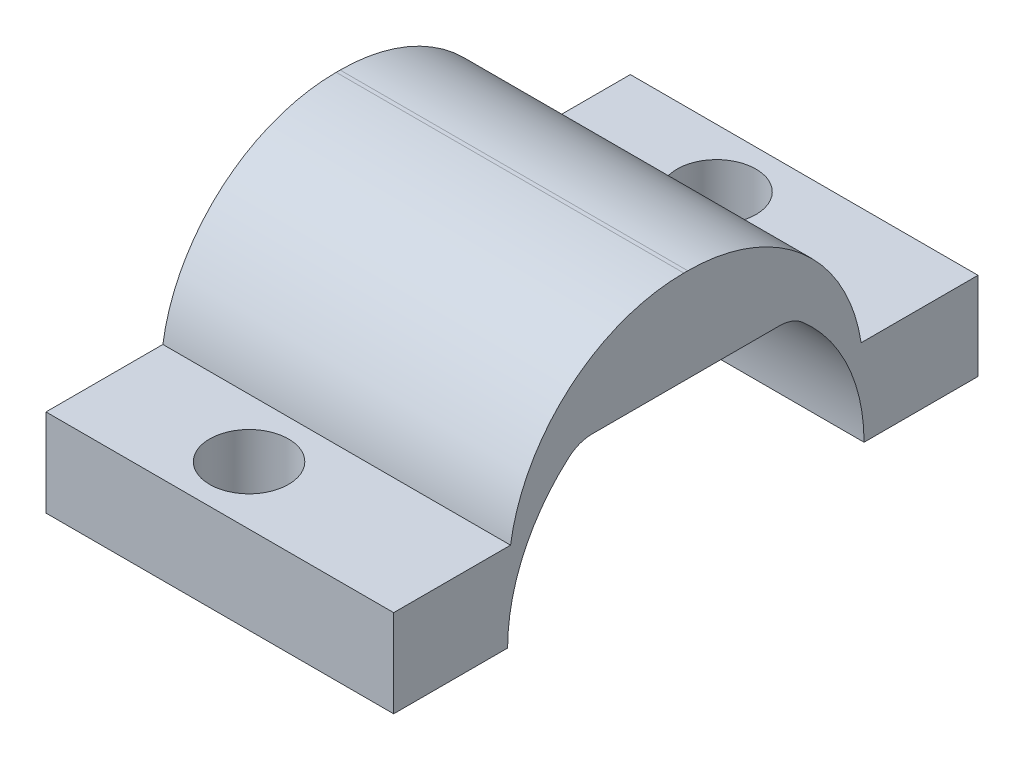
ISO-10303-21;
HEADER;
FILE_DESCRIPTION(('STEP AP214'),'2;1');
FILE_NAME('part.step','',(''),(''),'','','');
FILE_SCHEMA(('AUTOMOTIVE_DESIGN { 1 0 10303 214 1 1 1 1 }'));
ENDSEC;
DATA;
#1=APPLICATION_CONTEXT('core data for automotive mechanical design processes');
#2=APPLICATION_PROTOCOL_DEFINITION('international standard','automotive_design',2000,#1);
#3=PRODUCT_CONTEXT('',#1,'mechanical');
#4=PRODUCT('Part','Part','',(#3));
#5=PRODUCT_RELATED_PRODUCT_CATEGORY('part','',(#4));
#6=PRODUCT_DEFINITION_FORMATION('','',#4);
#7=PRODUCT_DEFINITION_CONTEXT('part definition',#1,'design');
#8=PRODUCT_DEFINITION('design','',#6,#7);
#9=PRODUCT_DEFINITION_SHAPE('','',#8);
#10=(LENGTH_UNIT() NAMED_UNIT(*) SI_UNIT(.MILLI.,.METRE.));
#11=(NAMED_UNIT(*) PLANE_ANGLE_UNIT() SI_UNIT($,.RADIAN.));
#12=(NAMED_UNIT(*) SI_UNIT($,.STERADIAN.) SOLID_ANGLE_UNIT());
#13=UNCERTAINTY_MEASURE_WITH_UNIT(LENGTH_MEASURE(1.E-05),#10,'distance_accuracy_value','');
#14=(GEOMETRIC_REPRESENTATION_CONTEXT(3) GLOBAL_UNCERTAINTY_ASSIGNED_CONTEXT((#13)) GLOBAL_UNIT_ASSIGNED_CONTEXT((#10,
#11,#12)) REPRESENTATION_CONTEXT('',''));
#15=CARTESIAN_POINT('',(0.,0.,0.));
#16=DIRECTION('',(0.,0.,1.));
#17=DIRECTION('',(1.,0.,0.));
#18=AXIS2_PLACEMENT_3D('',#15,#16,#17);
#19=CARTESIAN_POINT('',(13.9,0.,0.));
#20=DIRECTION('',(-1.,0.,0.));
#21=DIRECTION('',(0.,0.,1.));
#22=AXIS2_PLACEMENT_3D('',#19,#20,#21);
#23=CYLINDRICAL_SURFACE('',#22,6.1);
#24=CARTESIAN_POINT('',(2.,0.,0.));
#25=DIRECTION('',(1.,0.,0.));
#26=DIRECTION('',(0.,0.,-1.));
#27=AXIS2_PLACEMENT_3D('',#24,#25,#26);
#28=CIRCLE('',#27,6.1);
#29=CARTESIAN_POINT('',(2.,4.60612244897959,3.99920441900714));
#30=VERTEX_POINT('',#29);
#31=CARTESIAN_POINT('',(2.,0.,6.1));
#32=VERTEX_POINT('',#31);
#33=EDGE_CURVE('E236',#30,#32,#28,.T.);
#34=ORIENTED_EDGE('',*,*,#33,.F.);
#35=DIRECTION('',(-1.,0.,0.));
#36=VECTOR('',#35,1.);
#37=CARTESIAN_POINT('',(13.9,4.60612244897959,3.99920441900714));
#38=LINE('',#37,#36);
#39=CARTESIAN_POINT('',(13.9,4.60612244897959,3.99920441900714));
#40=VERTEX_POINT('',#39);
#41=EDGE_CURVE('E69',#30,#40,#38,.F.);
#42=ORIENTED_EDGE('',*,*,#41,.T.);
#43=CARTESIAN_POINT('',(13.9,0.,0.));
#44=DIRECTION('',(1.,0.,0.));
#45=DIRECTION('',(0.,0.,-1.));
#46=AXIS2_PLACEMENT_3D('',#43,#44,#45);
#47=CIRCLE('',#46,6.1);
#48=CARTESIAN_POINT('',(13.9,0.,6.1));
#49=VERTEX_POINT('',#48);
#50=EDGE_CURVE('E227',#40,#49,#47,.T.);
#51=ORIENTED_EDGE('',*,*,#50,.T.);
#52=DIRECTION('',(-1.,0.,0.));
#53=VECTOR('',#52,1.);
#54=CARTESIAN_POINT('',(13.9,0.,6.1));
#55=LINE('',#54,#53);
#56=EDGE_CURVE('E240',#49,#32,#55,.T.);
#57=ORIENTED_EDGE('',*,*,#56,.T.);
#58=EDGE_LOOP('',(#34,#42,#51,#57));
#59=FACE_BOUND('',#58,.T.);
#60=ADVANCED_FACE('F46',(#59),#23,.F.);
#61=CARTESIAN_POINT('',(13.9,4.9,0.));
#62=DIRECTION('',(0.,1.,0.));
#63=DIRECTION('',(0.,0.,1.));
#64=AXIS2_PLACEMENT_3D('',#61,#62,#63);
#65=PLANE('',#64);
#66=DIRECTION('',(-1.,0.,0.));
#67=VECTOR('',#66,1.);
#68=CARTESIAN_POINT('',(13.9,4.9,3.2124756808418));
#69=LINE('',#68,#67);
#70=CARTESIAN_POINT('',(13.9,4.9,3.2124756808418));
#71=VERTEX_POINT('',#70);
#72=CARTESIAN_POINT('',(2.,4.9,3.2124756808418));
#73=VERTEX_POINT('',#72);
#74=EDGE_CURVE('E206',#71,#73,#69,.T.);
#75=ORIENTED_EDGE('',*,*,#74,.T.);
#76=DIRECTION('',(0.,0.,-1.));
#77=VECTOR('',#76,1.);
#78=CARTESIAN_POINT('',(2.,4.9,0.));
#79=LINE('',#78,#77);
#80=CARTESIAN_POINT('',(2.,4.9,-3.2124756808418));
#81=VERTEX_POINT('',#80);
#82=EDGE_CURVE('E62',#73,#81,#79,.T.);
#83=ORIENTED_EDGE('',*,*,#82,.T.);
#84=DIRECTION('',(-1.,0.,0.));
#85=VECTOR('',#84,1.);
#86=CARTESIAN_POINT('',(13.9,4.9,-3.2124756808418));
#87=LINE('',#86,#85);
#88=CARTESIAN_POINT('',(13.9,4.9,-3.2124756808418));
#89=VERTEX_POINT('',#88);
#90=EDGE_CURVE('E210',#81,#89,#87,.F.);
#91=ORIENTED_EDGE('',*,*,#90,.T.);
#92=DIRECTION('',(0.,0.,-1.));
#93=VECTOR('',#92,1.);
#94=CARTESIAN_POINT('',(13.9,4.9,0.));
#95=LINE('',#94,#93);
#96=EDGE_CURVE('E224',#71,#89,#95,.T.);
#97=ORIENTED_EDGE('',*,*,#96,.F.);
#98=EDGE_LOOP('',(#75,#83,#91,#97));
#99=FACE_BOUND('',#98,.T.);
#100=ADVANCED_FACE('F231',(#99),#65,.F.);
#101=CARTESIAN_POINT('',(2.,0.,0.));
#102=DIRECTION('',(1.,0.,0.));
#103=DIRECTION('',(0.,0.,-1.));
#104=AXIS2_PLACEMENT_3D('',#101,#102,#103);
#105=CIRCLE('',#104,6.1);
#106=CARTESIAN_POINT('',(2.,0.,-6.1));
#107=VERTEX_POINT('',#106);
#108=CARTESIAN_POINT('',(2.,4.60612244897959,-3.99920441900714));
#109=VERTEX_POINT('',#108);
#110=EDGE_CURVE('E247',#107,#109,#105,.T.);
#111=ORIENTED_EDGE('',*,*,#110,.F.);
#112=DIRECTION('',(-1.,0.,0.));
#113=VECTOR('',#112,1.);
#114=CARTESIAN_POINT('',(13.9,0.,-6.1));
#115=LINE('',#114,#113);
#116=CARTESIAN_POINT('',(13.9,0.,-6.1));
#117=VERTEX_POINT('',#116);
#118=EDGE_CURVE('E167',#117,#107,#115,.T.);
#119=ORIENTED_EDGE('',*,*,#118,.F.);
#120=CARTESIAN_POINT('',(13.9,4.60612244897959,-3.99920441900714));
#121=VERTEX_POINT('',#120);
#122=EDGE_CURVE('E234',#117,#121,#47,.T.);
#123=ORIENTED_EDGE('',*,*,#122,.T.);
#124=DIRECTION('',(-1.,0.,0.));
#125=VECTOR('',#124,1.);
#126=CARTESIAN_POINT('',(13.9,4.60612244897959,-3.99920441900714));
#127=LINE('',#126,#125);
#128=EDGE_CURVE('E196',#121,#109,#127,.T.);
#129=ORIENTED_EDGE('',*,*,#128,.T.);
#130=EDGE_LOOP('',(#111,#119,#123,#129));
#131=FACE_BOUND('',#130,.T.);
#132=ADVANCED_FACE('F332',(#131),#23,.F.);
#133=CARTESIAN_POINT('',(13.9,0.,0.));
#134=DIRECTION('',(0.,1.,0.));
#135=DIRECTION('',(0.,0.,1.));
#136=AXIS2_PLACEMENT_3D('',#133,#134,#135);
#137=PLANE('',#136);
#138=CARTESIAN_POINT('',(6.95,0.,-8.));
#139=DIRECTION('',(0.,1.,0.));
#140=DIRECTION('',(0.,0.,1.));
#141=AXIS2_PLACEMENT_3D('',#138,#139,#140);
#142=CIRCLE('',#141,1.35);
#143=CARTESIAN_POINT('',(6.95,0.,-6.65));
#144=VERTEX_POINT('',#143);
#145=EDGE_CURVE('E201',#144,#144,#142,.T.);
#146=ORIENTED_EDGE('',*,*,#145,.T.);
#147=EDGE_LOOP('',(#146));
#148=FACE_BOUND('',#147,.T.);
#149=ORIENTED_EDGE('',*,*,#118,.T.);
#150=DIRECTION('',(0.,0.,-1.));
#151=VECTOR('',#150,1.);
#152=CARTESIAN_POINT('',(2.,0.,-10.));
#153=LINE('',#152,#151);
#154=CARTESIAN_POINT('',(2.,0.,-10.));
#155=VERTEX_POINT('',#154);
#156=EDGE_CURVE('E149',#107,#155,#153,.T.);
#157=ORIENTED_EDGE('',*,*,#156,.T.);
#158=DIRECTION('',(-1.,0.,0.));
#159=VECTOR('',#158,1.);
#160=CARTESIAN_POINT('',(13.9,0.,-10.));
#161=LINE('',#160,#159);
#162=CARTESIAN_POINT('',(13.9,0.,-10.));
#163=VERTEX_POINT('',#162);
#164=EDGE_CURVE('E165',#163,#155,#161,.T.);
#165=ORIENTED_EDGE('',*,*,#164,.F.);
#166=DIRECTION('',(0.,0.,-1.));
#167=VECTOR('',#166,1.);
#168=CARTESIAN_POINT('',(13.9,0.,0.));
#169=LINE('',#168,#167);
#170=EDGE_CURVE('E279',#117,#163,#169,.T.);
#171=ORIENTED_EDGE('',*,*,#170,.F.);
#172=EDGE_LOOP('',(#149,#157,#165,#171));
#173=FACE_BOUND('',#172,.T.);
#174=ADVANCED_FACE('F163',(#148,#173),#137,.F.);
#175=CARTESIAN_POINT('',(13.9,0.,-10.));
#176=DIRECTION('',(0.,0.,1.));
#177=DIRECTION('',(1.,0.,0.));
#178=AXIS2_PLACEMENT_3D('',#175,#176,#177);
#179=PLANE('',#178);
#180=ORIENTED_EDGE('',*,*,#164,.T.);
#181=DIRECTION('',(0.,1.,0.));
#182=VECTOR('',#181,1.);
#183=CARTESIAN_POINT('',(2.,0.,-10.));
#184=LINE('',#183,#182);
#185=CARTESIAN_POINT('',(2.,3.,-10.));
#186=VERTEX_POINT('',#185);
#187=EDGE_CURVE('E146',#155,#186,#184,.T.);
#188=ORIENTED_EDGE('',*,*,#187,.T.);
#189=DIRECTION('',(-1.,0.,0.));
#190=VECTOR('',#189,1.);
#191=CARTESIAN_POINT('',(13.9,3.,-10.));
#192=LINE('',#191,#190);
#193=CARTESIAN_POINT('',(13.9,3.,-10.));
#194=VERTEX_POINT('',#193);
#195=EDGE_CURVE('E174',#194,#186,#192,.T.);
#196=ORIENTED_EDGE('',*,*,#195,.F.);
#197=DIRECTION('',(0.,1.,0.));
#198=VECTOR('',#197,1.);
#199=CARTESIAN_POINT('',(13.9,0.,-10.));
#200=LINE('',#199,#198);
#201=EDGE_CURVE('E172',#163,#194,#200,.T.);
#202=ORIENTED_EDGE('',*,*,#201,.F.);
#203=EDGE_LOOP('',(#180,#188,#196,#202));
#204=FACE_BOUND('',#203,.T.);
#205=ADVANCED_FACE('F171',(#204),#179,.F.);
#206=CARTESIAN_POINT('',(13.9,3.,0.));
#207=DIRECTION('',(0.,-1.,0.));
#208=DIRECTION('',(0.,0.,-1.));
#209=AXIS2_PLACEMENT_3D('',#206,#207,#208);
#210=PLANE('',#209);
#211=CARTESIAN_POINT('',(6.95,3.,-8.));
#212=DIRECTION('',(0.,1.,0.));
#213=DIRECTION('',(0.,0.,1.));
#214=AXIS2_PLACEMENT_3D('',#211,#212,#213);
#215=CIRCLE('',#214,1.35);
#216=CARTESIAN_POINT('',(6.95,3.,-6.65));
#217=VERTEX_POINT('',#216);
#218=EDGE_CURVE('E202',#217,#217,#215,.T.);
#219=ORIENTED_EDGE('',*,*,#218,.F.);
#220=EDGE_LOOP('',(#219));
#221=FACE_BOUND('',#220,.T.);
#222=ORIENTED_EDGE('',*,*,#195,.T.);
#223=DIRECTION('',(0.,0.,1.));
#224=VECTOR('',#223,1.);
#225=CARTESIAN_POINT('',(2.,3.,0.));
#226=LINE('',#225,#224);
#227=CARTESIAN_POINT('',(2.,3.,-6.));
#228=VERTEX_POINT('',#227);
#229=EDGE_CURVE('E152',#186,#228,#226,.T.);
#230=ORIENTED_EDGE('',*,*,#229,.T.);
#231=DIRECTION('',(-1.,0.,0.));
#232=VECTOR('',#231,1.);
#233=CARTESIAN_POINT('',(13.9,3.,-6.));
#234=LINE('',#233,#232);
#235=CARTESIAN_POINT('',(13.9,3.,-6.));
#236=VERTEX_POINT('',#235);
#237=EDGE_CURVE('E180',#236,#228,#234,.T.);
#238=ORIENTED_EDGE('',*,*,#237,.F.);
#239=DIRECTION('',(0.,0.,1.));
#240=VECTOR('',#239,1.);
#241=CARTESIAN_POINT('',(13.9,3.,0.));
#242=LINE('',#241,#240);
#243=EDGE_CURVE('E284',#194,#236,#242,.T.);
#244=ORIENTED_EDGE('',*,*,#243,.F.);
#245=EDGE_LOOP('',(#222,#230,#238,#244));
#246=FACE_BOUND('',#245,.T.);
#247=ADVANCED_FACE('F326',(#221,#246),#210,.F.);
#248=CARTESIAN_POINT('',(13.9,8.1,0.));
#249=DIRECTION('',(0.,1.,0.));
#250=DIRECTION('',(0.,0.,1.));
#251=AXIS2_PLACEMENT_3D('',#248,#249,#250);
#252=PLANE('',#251);
#253=DIRECTION('',(0.,0.,-1.));
#254=VECTOR('',#253,1.);
#255=CARTESIAN_POINT('',(2.,8.1,-10.));
#256=LINE('',#255,#254);
#257=CARTESIAN_POINT('',(2.,8.1,0.0678840200144422));
#258=VERTEX_POINT('',#257);
#259=CARTESIAN_POINT('',(2.,8.1,-0.0678840200144405));
#260=VERTEX_POINT('',#259);
#261=EDGE_CURVE('E169',#258,#260,#256,.T.);
#262=ORIENTED_EDGE('',*,*,#261,.F.);
#263=DIRECTION('',(1.,0.,0.));
#264=VECTOR('',#263,1.);
#265=CARTESIAN_POINT('',(13.9,8.1,0.0678840200144413));
#266=LINE('',#265,#264);
#267=CARTESIAN_POINT('',(13.9,8.1,0.0678840200144413));
#268=VERTEX_POINT('',#267);
#269=EDGE_CURVE('E187',#258,#268,#266,.T.);
#270=ORIENTED_EDGE('',*,*,#269,.T.);
#271=DIRECTION('',(0.,0.,-1.));
#272=VECTOR('',#271,1.);
#273=CARTESIAN_POINT('',(13.9,8.1,0.));
#274=LINE('',#273,#272);
#275=CARTESIAN_POINT('',(13.9,8.1,-0.0678840200144413));
#276=VERTEX_POINT('',#275);
#277=EDGE_CURVE('E287',#268,#276,#274,.T.);
#278=ORIENTED_EDGE('',*,*,#277,.T.);
#279=DIRECTION('',(-1.,0.,0.));
#280=VECTOR('',#279,1.);
#281=CARTESIAN_POINT('',(0.,8.1,-0.0678840200144413));
#282=LINE('',#281,#280);
#283=EDGE_CURVE('E178',#276,#260,#282,.T.);
#284=ORIENTED_EDGE('',*,*,#283,.T.);
#285=EDGE_LOOP('',(#262,#270,#278,#284));
#286=FACE_BOUND('',#285,.T.);
#287=ADVANCED_FACE('F366',(#286),#252,.T.);
#288=CARTESIAN_POINT('',(13.9,3.,0.));
#289=DIRECTION('',(0.,1.,0.));
#290=DIRECTION('',(0.,0.,1.));
#291=AXIS2_PLACEMENT_3D('',#288,#289,#290);
#292=PLANE('',#291);
#293=DIRECTION('',(0.,0.,-1.));
#294=VECTOR('',#293,1.);
#295=CARTESIAN_POINT('',(2.,3.,0.));
#296=LINE('',#295,#294);
#297=CARTESIAN_POINT('',(2.,3.,10.));
#298=VERTEX_POINT('',#297);
#299=CARTESIAN_POINT('',(2.,3.,6.));
#300=VERTEX_POINT('',#299);
#301=EDGE_CURVE('E261',#298,#300,#296,.T.);
#302=ORIENTED_EDGE('',*,*,#301,.F.);
#303=DIRECTION('',(-1.,0.,0.));
#304=VECTOR('',#303,1.);
#305=CARTESIAN_POINT('',(13.9,3.,10.));
#306=LINE('',#305,#304);
#307=CARTESIAN_POINT('',(13.9,3.,10.));
#308=VERTEX_POINT('',#307);
#309=EDGE_CURVE('E309',#308,#298,#306,.T.);
#310=ORIENTED_EDGE('',*,*,#309,.F.);
#311=DIRECTION('',(0.,0.,-1.));
#312=VECTOR('',#311,1.);
#313=CARTESIAN_POINT('',(13.9,3.,0.));
#314=LINE('',#313,#312);
#315=CARTESIAN_POINT('',(13.9,3.,6.));
#316=VERTEX_POINT('',#315);
#317=EDGE_CURVE('E291',#308,#316,#314,.T.);
#318=ORIENTED_EDGE('',*,*,#317,.T.);
#319=DIRECTION('',(-1.,0.,0.));
#320=VECTOR('',#319,1.);
#321=CARTESIAN_POINT('',(13.9,3.,6.));
#322=LINE('',#321,#320);
#323=EDGE_CURVE('E313',#316,#300,#322,.T.);
#324=ORIENTED_EDGE('',*,*,#323,.T.);
#325=EDGE_LOOP('',(#302,#310,#318,#324));
#326=FACE_BOUND('',#325,.T.);
#327=CARTESIAN_POINT('',(6.95,3.,8.));
#328=DIRECTION('',(0.,1.,0.));
#329=DIRECTION('',(0.,0.,1.));
#330=AXIS2_PLACEMENT_3D('',#327,#328,#329);
#331=CIRCLE('',#330,1.35);
#332=CARTESIAN_POINT('',(6.95,3.,9.35));
#333=VERTEX_POINT('',#332);
#334=EDGE_CURVE('E267',#333,#333,#331,.T.);
#335=ORIENTED_EDGE('',*,*,#334,.F.);
#336=EDGE_LOOP('',(#335));
#337=FACE_BOUND('',#336,.T.);
#338=ADVANCED_FACE('F370',(#326,#337),#292,.T.);
#339=CARTESIAN_POINT('',(13.9,0.,10.));
#340=DIRECTION('',(0.,0.,1.));
#341=DIRECTION('',(1.,0.,0.));
#342=AXIS2_PLACEMENT_3D('',#339,#340,#341);
#343=PLANE('',#342);
#344=DIRECTION('',(0.,1.,0.));
#345=VECTOR('',#344,1.);
#346=CARTESIAN_POINT('',(2.,0.,10.));
#347=LINE('',#346,#345);
#348=CARTESIAN_POINT('',(2.,0.,10.));
#349=VERTEX_POINT('',#348);
#350=EDGE_CURVE('E264',#349,#298,#347,.T.);
#351=ORIENTED_EDGE('',*,*,#350,.F.);
#352=DIRECTION('',(-1.,0.,0.));
#353=VECTOR('',#352,1.);
#354=CARTESIAN_POINT('',(13.9,0.,10.));
#355=LINE('',#354,#353);
#356=CARTESIAN_POINT('',(13.9,0.,10.));
#357=VERTEX_POINT('',#356);
#358=EDGE_CURVE('E305',#357,#349,#355,.T.);
#359=ORIENTED_EDGE('',*,*,#358,.F.);
#360=DIRECTION('',(0.,1.,0.));
#361=VECTOR('',#360,1.);
#362=CARTESIAN_POINT('',(13.9,0.,10.));
#363=LINE('',#362,#361);
#364=EDGE_CURVE('E295',#357,#308,#363,.T.);
#365=ORIENTED_EDGE('',*,*,#364,.T.);
#366=ORIENTED_EDGE('',*,*,#309,.T.);
#367=EDGE_LOOP('',(#351,#359,#365,#366));
#368=FACE_BOUND('',#367,.T.);
#369=ADVANCED_FACE('F374',(#368),#343,.T.);
#370=CARTESIAN_POINT('',(13.9,0.,0.));
#371=DIRECTION('',(0.,-1.,0.));
#372=DIRECTION('',(0.,0.,-1.));
#373=AXIS2_PLACEMENT_3D('',#370,#371,#372);
#374=PLANE('',#373);
#375=EDGE_CURVE('E158',#349,#32,#153,.T.);
#376=ORIENTED_EDGE('',*,*,#375,.T.);
#377=ORIENTED_EDGE('',*,*,#56,.F.);
#378=DIRECTION('',(0.,0.,1.));
#379=VECTOR('',#378,1.);
#380=CARTESIAN_POINT('',(13.9,0.,0.));
#381=LINE('',#380,#379);
#382=EDGE_CURVE('E299',#49,#357,#381,.T.);
#383=ORIENTED_EDGE('',*,*,#382,.T.);
#384=ORIENTED_EDGE('',*,*,#358,.T.);
#385=EDGE_LOOP('',(#376,#377,#383,#384));
#386=FACE_BOUND('',#385,.T.);
#387=CARTESIAN_POINT('',(6.95,0.,8.));
#388=DIRECTION('',(0.,-1.,0.));
#389=DIRECTION('',(0.,0.,-1.));
#390=AXIS2_PLACEMENT_3D('',#387,#388,#389);
#391=CIRCLE('',#390,1.35);
#392=CARTESIAN_POINT('',(6.95,0.,6.65));
#393=VERTEX_POINT('',#392);
#394=EDGE_CURVE('E197',#393,#393,#391,.T.);
#395=ORIENTED_EDGE('',*,*,#394,.F.);
#396=EDGE_LOOP('',(#395));
#397=FACE_BOUND('',#396,.T.);
#398=ADVANCED_FACE('F378',(#386,#397),#374,.T.);
#399=CARTESIAN_POINT('',(13.9,0.,0.));
#400=DIRECTION('',(1.,0.,0.));
#401=DIRECTION('',(0.,0.,-1.));
#402=AXIS2_PLACEMENT_3D('',#399,#400,#401);
#403=PLANE('',#402);
#404=ORIENTED_EDGE('',*,*,#277,.F.);
#405=CARTESIAN_POINT('',(13.9,2.1,0.0678840200144413));
#406=DIRECTION('',(1.,0.,0.));
#407=DIRECTION('',(0.,0.,-1.));
#408=AXIS2_PLACEMENT_3D('',#405,#406,#407);
#409=CIRCLE('',#408,6.);
#410=EDGE_CURVE('E193',#268,#316,#409,.T.);
#411=ORIENTED_EDGE('',*,*,#410,.T.);
#412=ORIENTED_EDGE('',*,*,#317,.F.);
#413=ORIENTED_EDGE('',*,*,#364,.F.);
#414=ORIENTED_EDGE('',*,*,#382,.F.);
#415=ORIENTED_EDGE('',*,*,#50,.F.);
#416=CARTESIAN_POINT('',(13.9,3.7,3.2124756808418));
#417=DIRECTION('',(1.,0.,0.));
#418=DIRECTION('',(0.,0.,-1.));
#419=AXIS2_PLACEMENT_3D('',#416,#417,#418);
#420=CIRCLE('',#419,1.2);
#421=EDGE_CURVE('E55',#40,#71,#420,.F.);
#422=ORIENTED_EDGE('',*,*,#421,.T.);
#423=ORIENTED_EDGE('',*,*,#96,.T.);
#424=CARTESIAN_POINT('',(13.9,3.7,-3.2124756808418));
#425=DIRECTION('',(1.,0.,0.));
#426=DIRECTION('',(0.,0.,-1.));
#427=AXIS2_PLACEMENT_3D('',#424,#425,#426);
#428=CIRCLE('',#427,1.2);
#429=EDGE_CURVE('E215',#89,#121,#428,.F.);
#430=ORIENTED_EDGE('',*,*,#429,.T.);
#431=ORIENTED_EDGE('',*,*,#122,.F.);
#432=ORIENTED_EDGE('',*,*,#170,.T.);
#433=ORIENTED_EDGE('',*,*,#201,.T.);
#434=ORIENTED_EDGE('',*,*,#243,.T.);
#435=CARTESIAN_POINT('',(13.9,2.1,-0.0678840200144413));
#436=DIRECTION('',(1.,0.,0.));
#437=DIRECTION('',(0.,0.,-1.));
#438=AXIS2_PLACEMENT_3D('',#435,#436,#437);
#439=CIRCLE('',#438,6.);
#440=EDGE_CURVE('E190',#236,#276,#439,.T.);
#441=ORIENTED_EDGE('',*,*,#440,.T.);
#442=EDGE_LOOP('',(#404,#411,#412,#413,#414,#415,#422,#423,#430,#431,#432,#433,#434,#441));
#443=FACE_BOUND('',#442,.T.);
#444=ADVANCED_FACE('F223',(#443),#403,.T.);
#445=CARTESIAN_POINT('',(13.9,2.1,0.0678840200144413));
#446=DIRECTION('',(-1.,0.,0.));
#447=DIRECTION('',(0.,0.,1.));
#448=AXIS2_PLACEMENT_3D('',#445,#446,#447);
#449=CYLINDRICAL_SURFACE('',#448,6.);
#450=CARTESIAN_POINT('',(2.,2.1,0.0678840200144413));
#451=DIRECTION('',(1.,0.,0.));
#452=DIRECTION('',(0.,0.,-1.));
#453=AXIS2_PLACEMENT_3D('',#450,#451,#452);
#454=CIRCLE('',#453,6.);
#455=EDGE_CURVE('E258',#300,#258,#454,.F.);
#456=ORIENTED_EDGE('',*,*,#455,.F.);
#457=ORIENTED_EDGE('',*,*,#323,.F.);
#458=ORIENTED_EDGE('',*,*,#410,.F.);
#459=ORIENTED_EDGE('',*,*,#269,.F.);
#460=EDGE_LOOP('',(#456,#457,#458,#459));
#461=FACE_BOUND('',#460,.T.);
#462=ADVANCED_FACE('F384',(#461),#449,.T.);
#463=CARTESIAN_POINT('',(13.9,2.1,-0.0678840200144413));
#464=DIRECTION('',(1.,0.,0.));
#465=DIRECTION('',(0.,0.,-1.));
#466=AXIS2_PLACEMENT_3D('',#463,#464,#465);
#467=CYLINDRICAL_SURFACE('',#466,6.);
#468=CARTESIAN_POINT('',(2.,2.1,-0.0678840200144413));
#469=DIRECTION('',(1.,0.,0.));
#470=DIRECTION('',(0.,0.,-1.));
#471=AXIS2_PLACEMENT_3D('',#468,#469,#470);
#472=CIRCLE('',#471,6.);
#473=EDGE_CURVE('E253',#260,#228,#472,.F.);
#474=ORIENTED_EDGE('',*,*,#473,.F.);
#475=ORIENTED_EDGE('',*,*,#283,.F.);
#476=ORIENTED_EDGE('',*,*,#440,.F.);
#477=ORIENTED_EDGE('',*,*,#237,.T.);
#478=EDGE_LOOP('',(#474,#475,#476,#477));
#479=FACE_BOUND('',#478,.T.);
#480=ADVANCED_FACE('F322',(#479),#467,.T.);
#481=CARTESIAN_POINT('',(6.95,-10.9,8.));
#482=DIRECTION('',(0.,1.,0.));
#483=DIRECTION('',(0.,0.,1.));
#484=AXIS2_PLACEMENT_3D('',#481,#482,#483);
#485=CYLINDRICAL_SURFACE('',#484,1.35);
#486=ORIENTED_EDGE('',*,*,#394,.T.);
#487=EDGE_LOOP('',(#486));
#488=FACE_BOUND('',#487,.T.);
#489=ORIENTED_EDGE('',*,*,#334,.T.);
#490=EDGE_LOOP('',(#489));
#491=FACE_BOUND('',#490,.T.);
#492=ADVANCED_FACE('F342',(#488,#491),#485,.F.);
#493=CARTESIAN_POINT('',(6.95,-10.9,-8.));
#494=DIRECTION('',(0.,1.,0.));
#495=DIRECTION('',(0.,0.,1.));
#496=AXIS2_PLACEMENT_3D('',#493,#494,#495);
#497=CYLINDRICAL_SURFACE('',#496,1.35);
#498=ORIENTED_EDGE('',*,*,#218,.T.);
#499=EDGE_LOOP('',(#498));
#500=FACE_BOUND('',#499,.T.);
#501=ORIENTED_EDGE('',*,*,#145,.F.);
#502=EDGE_LOOP('',(#501));
#503=FACE_BOUND('',#502,.T.);
#504=ADVANCED_FACE('F336',(#500,#503),#497,.F.);
#505=CARTESIAN_POINT('',(13.9,3.7,-3.2124756808418));
#506=DIRECTION('',(-1.,0.,0.));
#507=DIRECTION('',(0.,0.,1.));
#508=AXIS2_PLACEMENT_3D('',#505,#506,#507);
#509=CYLINDRICAL_SURFACE('',#508,1.2);
#510=ORIENTED_EDGE('',*,*,#90,.F.);
#511=CARTESIAN_POINT('',(2.,3.7,-3.2124756808418));
#512=DIRECTION('',(1.,0.,0.));
#513=DIRECTION('',(0.,0.,-1.));
#514=AXIS2_PLACEMENT_3D('',#511,#512,#513);
#515=CIRCLE('',#514,1.2);
#516=EDGE_CURVE('E242',#81,#109,#515,.F.);
#517=ORIENTED_EDGE('',*,*,#516,.T.);
#518=ORIENTED_EDGE('',*,*,#128,.F.);
#519=ORIENTED_EDGE('',*,*,#429,.F.);
#520=EDGE_LOOP('',(#510,#517,#518,#519));
#521=FACE_BOUND('',#520,.T.);
#522=ADVANCED_FACE('F334',(#521),#509,.F.);
#523=CARTESIAN_POINT('',(13.9,3.7,3.2124756808418));
#524=DIRECTION('',(-1.,0.,0.));
#525=DIRECTION('',(0.,0.,1.));
#526=AXIS2_PLACEMENT_3D('',#523,#524,#525);
#527=CYLINDRICAL_SURFACE('',#526,1.2);
#528=ORIENTED_EDGE('',*,*,#41,.F.);
#529=CARTESIAN_POINT('',(2.,3.7,3.2124756808418));
#530=DIRECTION('',(1.,0.,0.));
#531=DIRECTION('',(0.,0.,-1.));
#532=AXIS2_PLACEMENT_3D('',#529,#530,#531);
#533=CIRCLE('',#532,1.2);
#534=EDGE_CURVE('E11',#30,#73,#533,.F.);
#535=ORIENTED_EDGE('',*,*,#534,.T.);
#536=ORIENTED_EDGE('',*,*,#74,.F.);
#537=ORIENTED_EDGE('',*,*,#421,.F.);
#538=EDGE_LOOP('',(#528,#535,#536,#537));
#539=FACE_BOUND('',#538,.T.);
#540=ADVANCED_FACE('F48',(#539),#527,.F.);
#541=CARTESIAN_POINT('',(2.,0.,-10.));
#542=DIRECTION('',(1.,0.,0.));
#543=DIRECTION('',(0.,0.,-1.));
#544=AXIS2_PLACEMENT_3D('',#541,#542,#543);
#545=PLANE('',#544);
#546=ORIENTED_EDGE('',*,*,#350,.T.);
#547=ORIENTED_EDGE('',*,*,#301,.T.);
#548=ORIENTED_EDGE('',*,*,#455,.T.);
#549=ORIENTED_EDGE('',*,*,#261,.T.);
#550=ORIENTED_EDGE('',*,*,#473,.T.);
#551=ORIENTED_EDGE('',*,*,#229,.F.);
#552=ORIENTED_EDGE('',*,*,#187,.F.);
#553=ORIENTED_EDGE('',*,*,#156,.F.);
#554=ORIENTED_EDGE('',*,*,#110,.T.);
#555=ORIENTED_EDGE('',*,*,#516,.F.);
#556=ORIENTED_EDGE('',*,*,#82,.F.);
#557=ORIENTED_EDGE('',*,*,#534,.F.);
#558=ORIENTED_EDGE('',*,*,#33,.T.);
#559=ORIENTED_EDGE('',*,*,#375,.F.);
#560=EDGE_LOOP('',(#546,#547,#548,#549,#550,#551,#552,#553,#554,#555,#556,#557,#558,#559));
#561=FACE_BOUND('',#560,.T.);
#562=ADVANCED_FACE('F148',(#561),#545,.F.);
#563=CLOSED_SHELL('',(#60,#100,#132,#174,#205,#247,#287,#338,#369,#398,#444,#462,#480,#492,#504,
#522,#540,#562));
#564=MANIFOLD_SOLID_BREP('B2',#563);
#565=ADVANCED_BREP_SHAPE_REPRESENTATION('',(#18,#564),#14);
#566=SHAPE_DEFINITION_REPRESENTATION(#9,#565);
ENDSEC;
END-ISO-10303-21;
